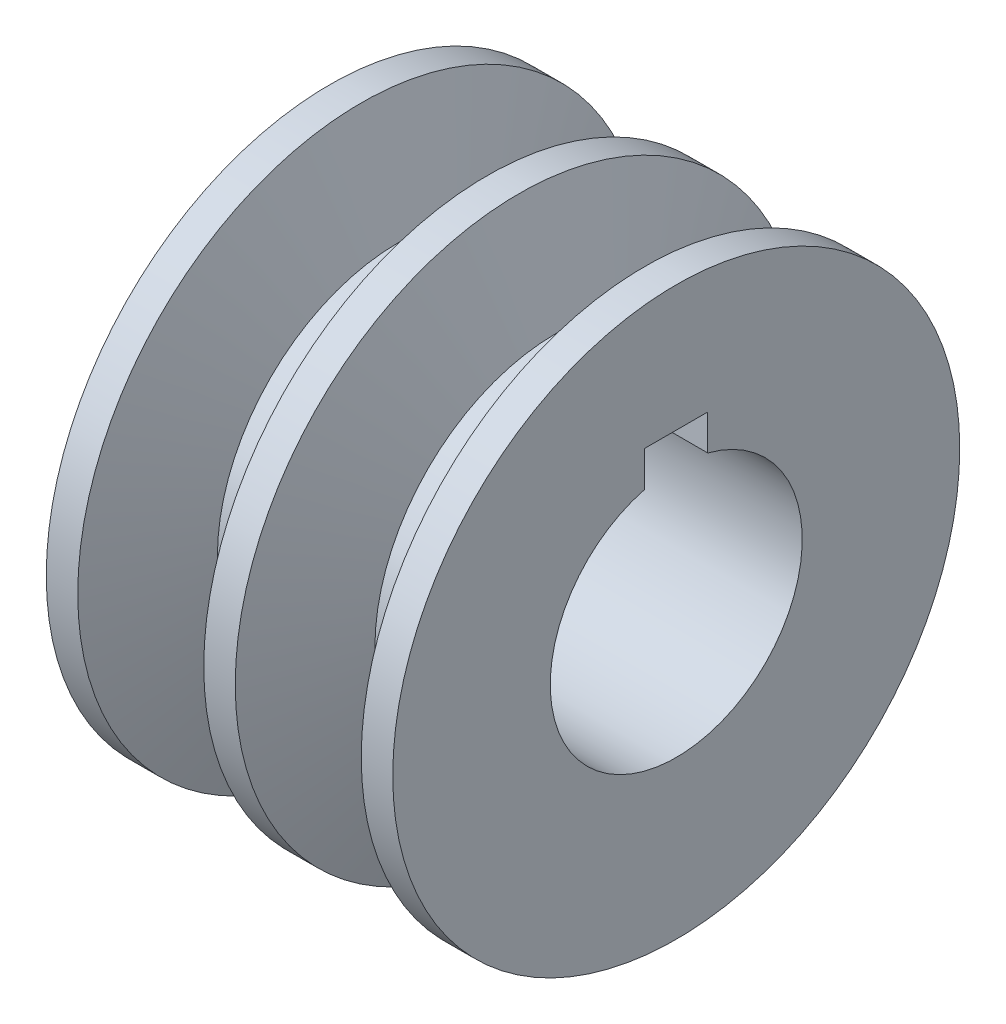
ISO-10303-21;
HEADER;
FILE_DESCRIPTION(('STEP AP214'),'2;1');
FILE_NAME('part.step','',(''),(''),'','','');
FILE_SCHEMA(('AUTOMOTIVE_DESIGN { 1 0 10303 214 1 1 1 1 }'));
ENDSEC;
DATA;
#1=APPLICATION_CONTEXT('core data for automotive mechanical design processes');
#2=APPLICATION_PROTOCOL_DEFINITION('international standard','automotive_design',2000,#1);
#3=PRODUCT_CONTEXT('',#1,'mechanical');
#4=PRODUCT('Part','Part','',(#3));
#5=PRODUCT_RELATED_PRODUCT_CATEGORY('part','',(#4));
#6=PRODUCT_DEFINITION_FORMATION('','',#4);
#7=PRODUCT_DEFINITION_CONTEXT('part definition',#1,'design');
#8=PRODUCT_DEFINITION('design','',#6,#7);
#9=PRODUCT_DEFINITION_SHAPE('','',#8);
#10=(LENGTH_UNIT() NAMED_UNIT(*) SI_UNIT(.MILLI.,.METRE.));
#11=(NAMED_UNIT(*) PLANE_ANGLE_UNIT() SI_UNIT($,.RADIAN.));
#12=(NAMED_UNIT(*) SI_UNIT($,.STERADIAN.) SOLID_ANGLE_UNIT());
#13=UNCERTAINTY_MEASURE_WITH_UNIT(LENGTH_MEASURE(1.E-05),#10,'distance_accuracy_value','');
#14=(GEOMETRIC_REPRESENTATION_CONTEXT(3) GLOBAL_UNCERTAINTY_ASSIGNED_CONTEXT((#13)) GLOBAL_UNIT_ASSIGNED_CONTEXT((#10,
#11,#12)) REPRESENTATION_CONTEXT('',''));
#15=CARTESIAN_POINT('',(0.,0.,0.));
#16=DIRECTION('',(0.,0.,1.));
#17=DIRECTION('',(1.,0.,0.));
#18=AXIS2_PLACEMENT_3D('',#15,#16,#17);
#19=CARTESIAN_POINT('',(38.1,0.,0.));
#20=DIRECTION('',(-1.,0.,0.));
#21=DIRECTION('',(0.,0.,1.));
#22=AXIS2_PLACEMENT_3D('',#19,#20,#21);
#23=CYLINDRICAL_SURFACE('',#22,28.575);
#24=CARTESIAN_POINT('',(3.17500000000003,0.,0.));
#25=DIRECTION('',(1.,0.,0.));
#26=DIRECTION('',(0.,0.,-1.));
#27=AXIS2_PLACEMENT_3D('',#24,#25,#26);
#28=CIRCLE('',#27,28.575);
#29=CARTESIAN_POINT('',(3.17500000000003,0.,28.575));
#30=VERTEX_POINT('',#29);
#31=EDGE_CURVE('E81',#30,#30,#28,.T.);
#32=CARTESIAN_POINT('',(0.,0.,0.));
#33=DIRECTION('',(1.,0.,0.));
#34=DIRECTION('',(0.,0.,-1.));
#35=AXIS2_PLACEMENT_3D('',#32,#33,#34);
#36=CIRCLE('',#35,28.575);
#37=CARTESIAN_POINT('',(0.,0.,28.575));
#38=VERTEX_POINT('',#37);
#39=EDGE_CURVE('E92',#38,#38,#36,.T.);
#40=CARTESIAN_POINT('',(3.17500000000003,0.,28.575));
#41=CARTESIAN_POINT('',(3.14192708333336,0.,28.575));
#42=CARTESIAN_POINT('',(3.10885416666669,0.,28.575));
#43=CARTESIAN_POINT('',(3.04270833333336,0.,28.575));
#44=CARTESIAN_POINT('',(3.00963541666669,0.,28.575));
#45=CARTESIAN_POINT('',(2.94348958333336,0.,28.575));
#46=CARTESIAN_POINT('',(2.91041666666669,0.,28.575));
#47=CARTESIAN_POINT('',(2.84427083333336,0.,28.575));
#48=CARTESIAN_POINT('',(2.81119791666669,0.,28.575));
#49=CARTESIAN_POINT('',(2.74505208333335,0.,28.575));
#50=CARTESIAN_POINT('',(2.71197916666669,0.,28.575));
#51=CARTESIAN_POINT('',(2.64583333333335,0.,28.575));
#52=CARTESIAN_POINT('',(2.61276041666669,0.,28.575));
#53=CARTESIAN_POINT('',(2.54661458333335,0.,28.575));
#54=CARTESIAN_POINT('',(2.51354166666669,0.,28.575));
#55=CARTESIAN_POINT('',(2.44739583333335,0.,28.575));
#56=CARTESIAN_POINT('',(2.41432291666668,0.,28.575));
#57=CARTESIAN_POINT('',(2.34817708333335,0.,28.575));
#58=CARTESIAN_POINT('',(2.31510416666668,0.,28.575));
#59=CARTESIAN_POINT('',(2.24895833333335,0.,28.575));
#60=CARTESIAN_POINT('',(2.21588541666669,0.,28.575));
#61=CARTESIAN_POINT('',(2.14973958333335,0.,28.575));
#62=CARTESIAN_POINT('',(2.11666666666668,0.,28.575));
#63=CARTESIAN_POINT('',(2.05052083333335,0.,28.575));
#64=CARTESIAN_POINT('',(2.01744791666668,0.,28.575));
#65=CARTESIAN_POINT('',(1.95130208333335,0.,28.575));
#66=CARTESIAN_POINT('',(1.91822916666668,0.,28.575));
#67=CARTESIAN_POINT('',(1.85208333333335,0.,28.575));
#68=CARTESIAN_POINT('',(1.81901041666668,0.,28.575));
#69=CARTESIAN_POINT('',(1.75286458333335,0.,28.575));
#70=CARTESIAN_POINT('',(1.71979166666668,0.,28.575));
#71=CARTESIAN_POINT('',(1.65364583333334,0.,28.575));
#72=CARTESIAN_POINT('',(1.62057291666668,0.,28.575));
#73=CARTESIAN_POINT('',(1.55442708333335,0.,28.575));
#74=CARTESIAN_POINT('',(1.52135416666668,0.,28.575));
#75=CARTESIAN_POINT('',(1.45520833333335,0.,28.575));
#76=CARTESIAN_POINT('',(1.42213541666668,0.,28.575));
#77=CARTESIAN_POINT('',(1.35598958333334,0.,28.575));
#78=CARTESIAN_POINT('',(1.32291666666668,0.,28.575));
#79=CARTESIAN_POINT('',(1.25677083333334,0.,28.575));
#80=CARTESIAN_POINT('',(1.22369791666668,0.,28.575));
#81=CARTESIAN_POINT('',(1.15755208333334,0.,28.575));
#82=CARTESIAN_POINT('',(1.12447916666668,0.,28.575));
#83=CARTESIAN_POINT('',(1.05833333333334,0.,28.575));
#84=CARTESIAN_POINT('',(1.02526041666667,0.,28.575));
#85=CARTESIAN_POINT('',(0.959114583333339,0.,28.575));
#86=CARTESIAN_POINT('',(0.926041666666673,0.,28.575));
#87=CARTESIAN_POINT('',(0.859895833333342,0.,28.575));
#88=CARTESIAN_POINT('',(0.826822916666676,0.,28.575));
#89=CARTESIAN_POINT('',(0.760677083333341,0.,28.575));
#90=CARTESIAN_POINT('',(0.727604166666673,0.,28.575));
#91=CARTESIAN_POINT('',(0.661458333333339,0.,28.575));
#92=CARTESIAN_POINT('',(0.628385416666673,0.,28.575));
#93=CARTESIAN_POINT('',(0.562239583333339,0.,28.575));
#94=CARTESIAN_POINT('',(0.529166666666671,0.,28.575));
#95=CARTESIAN_POINT('',(0.463020833333337,0.,28.575));
#96=CARTESIAN_POINT('',(0.429947916666671,0.,28.575));
#97=CARTESIAN_POINT('',(0.363802083333337,0.,28.575));
#98=CARTESIAN_POINT('',(0.330729166666668,0.,28.575));
#99=CARTESIAN_POINT('',(0.264583333333334,0.,28.575));
#100=CARTESIAN_POINT('',(0.231510416666668,0.,28.575));
#101=CARTESIAN_POINT('',(0.165364583333334,0.,28.575));
#102=CARTESIAN_POINT('',(0.132291666666666,0.,28.575));
#103=CARTESIAN_POINT('',(0.0661458333333318,0.,28.575));
#104=CARTESIAN_POINT('',(0.0330729166666659,0.,28.575));
#105=CARTESIAN_POINT('',(0.,0.,28.575));
#106=B_SPLINE_CURVE_WITH_KNOTS('',3,(#40,#41,#42,#43,#44,#45,#46,#47,#48,#49,#50,#51,#52,#53,
#54,#55,#56,#57,#58,#59,#60,#61,#62,#63,#64,#65,#66,#67,#68,#69,#70,#71,#72,#73,#74,#75,#76,#77,
#78,#79,#80,#81,#82,#83,#84,#85,#86,#87,#88,#89,#90,#91,#92,#93,#94,#95,#96,#97,#98,#99,#100,
#101,#102,#103,#104,#105),.UNSPECIFIED.,.F.,.F.,(4,2,2,2,2,2,2,2,2,2,2,2,2,2,2,2,2,2,2,2,2,2,2,
2,2,2,2,2,2,2,2,2,4),(0.,0.0992187499999977,0.198437500000002,0.29765625,0.396875000000005,
0.496093750000003,0.595312500000007,0.694531250000005,0.79375000000001,0.892968750000007,
0.992187500000005,1.09140625000001,1.19062500000001,1.28984375000001,1.38906250000001,
1.48828125000001,1.58750000000001,1.68671875000001,1.78593750000001,1.88515625000001,
1.98437500000002,2.08359375000002,2.18281250000002,2.28203125000002,2.38125000000002,
2.48046875000002,2.57968750000002,2.67890625000002,2.77812500000002,2.87734375000002,
2.97656250000002,3.07578125000003,3.17500000000003),.UNSPECIFIED.);
#107=EDGE_CURVE('BSEAM35',#30,#38,#106,.T.);
#108=ORIENTED_EDGE('',*,*,#31,.F.);
#109=ORIENTED_EDGE('',*,*,#39,.T.);
#110=ORIENTED_EDGE('',*,*,#107,.T.);
#111=ORIENTED_EDGE('',*,*,#107,.F.);
#112=EDGE_LOOP('',(#108,#110,#109,#111));
#113=FACE_BOUND('',#112,.T.);
#114=ADVANCED_FACE('F35',(#113),#23,.T.);
#115=CARTESIAN_POINT('',(38.1,0.,0.));
#116=DIRECTION('',(-1.,0.,0.));
#117=DIRECTION('',(0.,0.,1.));
#118=AXIS2_PLACEMENT_3D('',#115,#116,#117);
#119=CYLINDRICAL_SURFACE('',#118,12.7);
#120=CARTESIAN_POINT('',(34.925,0.,0.));
#121=DIRECTION('',(-1.,0.,0.));
#122=DIRECTION('',(0.,0.,1.));
#123=AXIS2_PLACEMENT_3D('',#120,#121,#122);
#124=CIRCLE('',#123,12.7);
#125=CARTESIAN_POINT('',(34.925,12.2967221242085,-3.175));
#126=VERTEX_POINT('',#125);
#127=CARTESIAN_POINT('',(34.925,12.2967221242085,3.175));
#128=VERTEX_POINT('',#127);
#129=EDGE_CURVE('E77',#126,#128,#124,.T.);
#130=ORIENTED_EDGE('',*,*,#129,.F.);
#131=DIRECTION('',(-1.,0.,0.));
#132=VECTOR('',#131,1.);
#133=CARTESIAN_POINT('',(38.1,12.2967221242085,-3.175));
#134=LINE('',#133,#132);
#135=CARTESIAN_POINT('',(0.,12.2967221242085,-3.175));
#136=VERTEX_POINT('',#135);
#137=EDGE_CURVE('E58',#126,#136,#134,.T.);
#138=ORIENTED_EDGE('',*,*,#137,.T.);
#139=CARTESIAN_POINT('',(0.,0.,0.));
#140=DIRECTION('',(1.,0.,0.));
#141=DIRECTION('',(0.,0.,-1.));
#142=AXIS2_PLACEMENT_3D('',#139,#140,#141);
#143=CIRCLE('',#142,12.7);
#144=CARTESIAN_POINT('',(0.,12.2967221242085,3.175));
#145=VERTEX_POINT('',#144);
#146=EDGE_CURVE('E84',#145,#136,#143,.T.);
#147=ORIENTED_EDGE('',*,*,#146,.F.);
#148=DIRECTION('',(-1.,0.,0.));
#149=VECTOR('',#148,1.);
#150=CARTESIAN_POINT('',(38.1,12.2967221242085,3.175));
#151=LINE('',#150,#149);
#152=EDGE_CURVE('E11',#128,#145,#151,.T.);
#153=ORIENTED_EDGE('',*,*,#152,.F.);
#154=EDGE_LOOP('',(#130,#138,#147,#153));
#155=FACE_BOUND('',#154,.T.);
#156=ADVANCED_FACE('F37',(#155),#119,.F.);
#157=CARTESIAN_POINT('',(38.1,0.,3.175));
#158=DIRECTION('',(0.,0.,1.));
#159=DIRECTION('',(1.,0.,0.));
#160=AXIS2_PLACEMENT_3D('',#157,#158,#159);
#161=PLANE('',#160);
#162=DIRECTION('',(-1.,0.,0.));
#163=VECTOR('',#162,1.);
#164=CARTESIAN_POINT('',(38.1,15.875,3.175));
#165=LINE('',#164,#163);
#166=CARTESIAN_POINT('',(34.925,15.875,3.175));
#167=VERTEX_POINT('',#166);
#168=CARTESIAN_POINT('',(0.,15.875,3.175));
#169=VERTEX_POINT('',#168);
#170=EDGE_CURVE('E43',#167,#169,#165,.T.);
#171=ORIENTED_EDGE('',*,*,#170,.F.);
#172=DIRECTION('',(0.,-1.,0.));
#173=VECTOR('',#172,1.);
#174=CARTESIAN_POINT('',(34.925,0.,3.175));
#175=LINE('',#174,#173);
#176=EDGE_CURVE('E85',#167,#128,#175,.T.);
#177=ORIENTED_EDGE('',*,*,#176,.T.);
#178=ORIENTED_EDGE('',*,*,#152,.T.);
#179=DIRECTION('',(0.,1.,0.));
#180=VECTOR('',#179,1.);
#181=CARTESIAN_POINT('',(0.,0.,3.175));
#182=LINE('',#181,#180);
#183=EDGE_CURVE('E107',#145,#169,#182,.T.);
#184=ORIENTED_EDGE('',*,*,#183,.T.);
#185=EDGE_LOOP('',(#171,#177,#178,#184));
#186=FACE_BOUND('',#185,.T.);
#187=ADVANCED_FACE('F108',(#186),#161,.F.);
#188=CARTESIAN_POINT('',(38.1,15.875,0.));
#189=DIRECTION('',(0.,1.,0.));
#190=DIRECTION('',(0.,0.,1.));
#191=AXIS2_PLACEMENT_3D('',#188,#189,#190);
#192=PLANE('',#191);
#193=DIRECTION('',(-1.,0.,0.));
#194=VECTOR('',#193,1.);
#195=CARTESIAN_POINT('',(38.1,15.875,-3.175));
#196=LINE('',#195,#194);
#197=CARTESIAN_POINT('',(34.925,15.875,-3.175));
#198=VERTEX_POINT('',#197);
#199=CARTESIAN_POINT('',(0.,15.875,-3.175));
#200=VERTEX_POINT('',#199);
#201=EDGE_CURVE('E91',#198,#200,#196,.T.);
#202=ORIENTED_EDGE('',*,*,#201,.F.);
#203=DIRECTION('',(0.,0.,1.));
#204=VECTOR('',#203,1.);
#205=CARTESIAN_POINT('',(34.925,15.875,0.));
#206=LINE('',#205,#204);
#207=EDGE_CURVE('E50',#198,#167,#206,.T.);
#208=ORIENTED_EDGE('',*,*,#207,.T.);
#209=ORIENTED_EDGE('',*,*,#170,.T.);
#210=DIRECTION('',(0.,0.,-1.));
#211=VECTOR('',#210,1.);
#212=CARTESIAN_POINT('',(0.,15.875,0.));
#213=LINE('',#212,#211);
#214=EDGE_CURVE('E104',#169,#200,#213,.T.);
#215=ORIENTED_EDGE('',*,*,#214,.T.);
#216=EDGE_LOOP('',(#202,#208,#209,#215));
#217=FACE_BOUND('',#216,.T.);
#218=ADVANCED_FACE('F102',(#217),#192,.F.);
#219=CARTESIAN_POINT('',(38.1,0.,-3.175));
#220=DIRECTION('',(0.,0.,1.));
#221=DIRECTION('',(1.,0.,0.));
#222=AXIS2_PLACEMENT_3D('',#219,#220,#221);
#223=PLANE('',#222);
#224=DIRECTION('',(0.,-1.,0.));
#225=VECTOR('',#224,1.);
#226=CARTESIAN_POINT('',(34.925,0.,-3.175));
#227=LINE('',#226,#225);
#228=EDGE_CURVE('E74',#198,#126,#227,.T.);
#229=ORIENTED_EDGE('',*,*,#228,.F.);
#230=ORIENTED_EDGE('',*,*,#201,.T.);
#231=DIRECTION('',(0.,1.,0.));
#232=VECTOR('',#231,1.);
#233=CARTESIAN_POINT('',(0.,0.,-3.175));
#234=LINE('',#233,#232);
#235=EDGE_CURVE('E90',#136,#200,#234,.T.);
#236=ORIENTED_EDGE('',*,*,#235,.F.);
#237=ORIENTED_EDGE('',*,*,#137,.F.);
#238=EDGE_LOOP('',(#229,#230,#236,#237));
#239=FACE_BOUND('',#238,.T.);
#240=ADVANCED_FACE('F88',(#239),#223,.T.);
#241=CARTESIAN_POINT('',(0.,0.,0.));
#242=DIRECTION('',(1.,0.,0.));
#243=DIRECTION('',(0.,0.,-1.));
#244=AXIS2_PLACEMENT_3D('',#241,#242,#243);
#245=PLANE('',#244);
#246=ORIENTED_EDGE('',*,*,#146,.T.);
#247=ORIENTED_EDGE('',*,*,#235,.T.);
#248=ORIENTED_EDGE('',*,*,#214,.F.);
#249=ORIENTED_EDGE('',*,*,#183,.F.);
#250=EDGE_LOOP('',(#246,#247,#248,#249));
#251=FACE_BOUND('',#250,.T.);
#252=ORIENTED_EDGE('',*,*,#39,.F.);
#253=EDGE_LOOP('',(#252));
#254=FACE_BOUND('',#253,.T.);
#255=ADVANCED_FACE('F111',(#251,#254),#245,.F.);
#256=CARTESIAN_POINT('',(34.925,28.575,0.));
#257=DIRECTION('',(-1.,0.,0.));
#258=DIRECTION('',(0.,0.,1.));
#259=AXIS2_PLACEMENT_3D('',#256,#257,#258);
#260=PLANE('',#259);
#261=ORIENTED_EDGE('',*,*,#129,.T.);
#262=ORIENTED_EDGE('',*,*,#176,.F.);
#263=ORIENTED_EDGE('',*,*,#207,.F.);
#264=ORIENTED_EDGE('',*,*,#228,.T.);
#265=EDGE_LOOP('',(#261,#262,#263,#264));
#266=FACE_BOUND('',#265,.T.);
#267=CARTESIAN_POINT('',(34.925,0.,0.));
#268=DIRECTION('',(1.,0.,0.));
#269=DIRECTION('',(0.,0.,-1.));
#270=AXIS2_PLACEMENT_3D('',#267,#268,#269);
#271=CIRCLE('',#270,28.575);
#272=CARTESIAN_POINT('',(34.925,0.,28.575));
#273=VERTEX_POINT('',#272);
#274=EDGE_CURVE('E141',#273,#273,#271,.T.);
#275=ORIENTED_EDGE('',*,*,#274,.T.);
#276=EDGE_LOOP('',(#275));
#277=FACE_BOUND('',#276,.T.);
#278=ADVANCED_FACE('F75',(#266,#277),#260,.F.);
#279=CARTESIAN_POINT('',(3.17500000000003,0.,0.));
#280=DIRECTION('',(-1.,0.,0.));
#281=DIRECTION('',(0.,0.,1.));
#282=AXIS2_PLACEMENT_3D('',#279,#280,#281);
#283=CONICAL_SURFACE('',#282,28.575,1.22173047639603);
#284=CARTESIAN_POINT('',(6.93071785483437,0.,0.));
#285=DIRECTION('',(1.,0.,0.));
#286=DIRECTION('',(0.,0.,-1.));
#287=AXIS2_PLACEMENT_3D('',#284,#285,#286);
#288=CIRCLE('',#287,18.25625);
#289=CARTESIAN_POINT('',(6.93071785483437,0.,-18.25625));
#290=VERTEX_POINT('',#289);
#291=EDGE_CURVE('E120',#290,#290,#288,.T.);
#292=ORIENTED_EDGE('',*,*,#291,.F.);
#293=EDGE_LOOP('',(#292));
#294=FACE_BOUND('',#293,.T.);
#295=ORIENTED_EDGE('',*,*,#31,.T.);
#296=EDGE_LOOP('',(#295));
#297=FACE_BOUND('',#296,.T.);
#298=ADVANCED_FACE('F183',(#294,#297),#283,.T.);
#299=CARTESIAN_POINT('',(-1.26294314309024,0.,0.));
#300=DIRECTION('',(1.,0.,0.));
#301=DIRECTION('',(0.,0.,-1.));
#302=AXIS2_PLACEMENT_3D('',#299,#300,#301);
#303=CYLINDRICAL_SURFACE('',#302,18.25625);
#304=CARTESIAN_POINT('',(12.1192821451657,0.,0.));
#305=DIRECTION('',(1.,0.,0.));
#306=DIRECTION('',(0.,0.,-1.));
#307=AXIS2_PLACEMENT_3D('',#304,#305,#306);
#308=CIRCLE('',#307,18.25625);
#309=CARTESIAN_POINT('',(12.1192821451657,0.,-18.25625));
#310=VERTEX_POINT('',#309);
#311=EDGE_CURVE('E123',#310,#310,#308,.T.);
#312=ORIENTED_EDGE('',*,*,#311,.F.);
#313=EDGE_LOOP('',(#312));
#314=FACE_BOUND('',#313,.T.);
#315=ORIENTED_EDGE('',*,*,#291,.T.);
#316=EDGE_LOOP('',(#315));
#317=FACE_BOUND('',#316,.T.);
#318=ADVANCED_FACE('F159',(#314,#317),#303,.T.);
#319=CARTESIAN_POINT('',(12.1192821451657,0.,0.));
#320=DIRECTION('',(1.,0.,0.));
#321=DIRECTION('',(0.,0.,-1.));
#322=AXIS2_PLACEMENT_3D('',#319,#320,#321);
#323=CONICAL_SURFACE('',#322,18.25625,1.22173047639603);
#324=CARTESIAN_POINT('',(15.875,0.,0.));
#325=DIRECTION('',(1.,0.,0.));
#326=DIRECTION('',(0.,0.,-1.));
#327=AXIS2_PLACEMENT_3D('',#324,#325,#326);
#328=CIRCLE('',#327,28.575);
#329=CARTESIAN_POINT('',(15.875,0.,28.575));
#330=VERTEX_POINT('',#329);
#331=EDGE_CURVE('E126',#330,#330,#328,.T.);
#332=ORIENTED_EDGE('',*,*,#331,.F.);
#333=EDGE_LOOP('',(#332));
#334=FACE_BOUND('',#333,.T.);
#335=ORIENTED_EDGE('',*,*,#311,.T.);
#336=EDGE_LOOP('',(#335));
#337=FACE_BOUND('',#336,.T.);
#338=ADVANCED_FACE('F148',(#334,#337),#323,.T.);
#339=CARTESIAN_POINT('',(31.75,0.,0.));
#340=DIRECTION('',(1.,0.,0.));
#341=DIRECTION('',(0.,0.,-1.));
#342=AXIS2_PLACEMENT_3D('',#339,#340,#341);
#343=CIRCLE('',#342,28.575);
#344=CARTESIAN_POINT('',(31.75,0.,28.575));
#345=VERTEX_POINT('',#344);
#346=EDGE_CURVE('E138',#345,#345,#343,.T.);
#347=CARTESIAN_POINT('',(31.75,0.,28.575));
#348=CARTESIAN_POINT('',(31.7830729166667,0.,28.575));
#349=CARTESIAN_POINT('',(31.8161458333334,0.,28.575));
#350=CARTESIAN_POINT('',(31.8822916666667,0.,28.575));
#351=CARTESIAN_POINT('',(31.9153645833334,0.,28.575));
#352=CARTESIAN_POINT('',(31.9815104166667,0.,28.575));
#353=CARTESIAN_POINT('',(32.0145833333334,0.,28.575));
#354=CARTESIAN_POINT('',(32.0807291666667,0.,28.575));
#355=CARTESIAN_POINT('',(32.1138020833334,0.,28.575));
#356=CARTESIAN_POINT('',(32.1799479166667,0.,28.575));
#357=CARTESIAN_POINT('',(32.2130208333334,0.,28.575));
#358=CARTESIAN_POINT('',(32.2791666666667,0.,28.575));
#359=CARTESIAN_POINT('',(32.3122395833334,0.,28.575));
#360=CARTESIAN_POINT('',(32.3783854166667,0.,28.575));
#361=CARTESIAN_POINT('',(32.4114583333334,0.,28.575));
#362=CARTESIAN_POINT('',(32.4776041666667,0.,28.575));
#363=CARTESIAN_POINT('',(32.5106770833334,0.,28.575));
#364=CARTESIAN_POINT('',(32.5768229166667,0.,28.575));
#365=CARTESIAN_POINT('',(32.6098958333334,0.,28.575));
#366=CARTESIAN_POINT('',(32.6760416666667,0.,28.575));
#367=CARTESIAN_POINT('',(32.7091145833334,0.,28.575));
#368=CARTESIAN_POINT('',(32.7752604166667,0.,28.575));
#369=CARTESIAN_POINT('',(32.8083333333334,0.,28.575));
#370=CARTESIAN_POINT('',(32.8744791666667,0.,28.575));
#371=CARTESIAN_POINT('',(32.9075520833334,0.,28.575));
#372=CARTESIAN_POINT('',(32.9736979166667,0.,28.575));
#373=CARTESIAN_POINT('',(33.0067708333333,0.,28.575));
#374=CARTESIAN_POINT('',(33.0729166666667,0.,28.575));
#375=CARTESIAN_POINT('',(33.1059895833334,0.,28.575));
#376=CARTESIAN_POINT('',(33.1721354166667,0.,28.575));
#377=CARTESIAN_POINT('',(33.2052083333334,0.,28.575));
#378=CARTESIAN_POINT('',(33.2713541666667,0.,28.575));
#379=CARTESIAN_POINT('',(33.3044270833334,0.,28.575));
#380=CARTESIAN_POINT('',(33.3705729166667,0.,28.575));
#381=CARTESIAN_POINT('',(33.4036458333334,0.,28.575));
#382=CARTESIAN_POINT('',(33.4697916666667,0.,28.575));
#383=CARTESIAN_POINT('',(33.5028645833334,0.,28.575));
#384=CARTESIAN_POINT('',(33.5690104166667,0.,28.575));
#385=CARTESIAN_POINT('',(33.6020833333334,0.,28.575));
#386=CARTESIAN_POINT('',(33.6682291666667,0.,28.575));
#387=CARTESIAN_POINT('',(33.7013020833334,0.,28.575));
#388=CARTESIAN_POINT('',(33.7674479166667,0.,28.575));
#389=CARTESIAN_POINT('',(33.8005208333334,0.,28.575));
#390=CARTESIAN_POINT('',(33.8666666666667,0.,28.575));
#391=CARTESIAN_POINT('',(33.8997395833333,0.,28.575));
#392=CARTESIAN_POINT('',(33.9658854166667,0.,28.575));
#393=CARTESIAN_POINT('',(33.9989583333334,0.,28.575));
#394=CARTESIAN_POINT('',(34.0651041666667,0.,28.575));
#395=CARTESIAN_POINT('',(34.0981770833334,0.,28.575));
#396=CARTESIAN_POINT('',(34.1643229166667,0.,28.575));
#397=CARTESIAN_POINT('',(34.1973958333334,0.,28.575));
#398=CARTESIAN_POINT('',(34.2635416666667,0.,28.575));
#399=CARTESIAN_POINT('',(34.2966145833334,0.,28.575));
#400=CARTESIAN_POINT('',(34.3627604166667,0.,28.575));
#401=CARTESIAN_POINT('',(34.3958333333334,0.,28.575));
#402=CARTESIAN_POINT('',(34.4619791666667,0.,28.575));
#403=CARTESIAN_POINT('',(34.4950520833334,0.,28.575));
#404=CARTESIAN_POINT('',(34.5611979166667,0.,28.575));
#405=CARTESIAN_POINT('',(34.5942708333334,0.,28.575));
#406=CARTESIAN_POINT('',(34.6604166666667,0.,28.575));
#407=CARTESIAN_POINT('',(34.6934895833334,0.,28.575));
#408=CARTESIAN_POINT('',(34.7596354166667,0.,28.575));
#409=CARTESIAN_POINT('',(34.7927083333334,0.,28.575));
#410=CARTESIAN_POINT('',(34.8588541666667,0.,28.575));
#411=CARTESIAN_POINT('',(34.8919270833333,0.,28.575));
#412=CARTESIAN_POINT('',(34.925,0.,28.575));
#413=B_SPLINE_CURVE_WITH_KNOTS('',3,(#347,#348,#349,#350,#351,#352,#353,#354,#355,#356,#357,
#358,#359,#360,#361,#362,#363,#364,#365,#366,#367,#368,#369,#370,#371,#372,#373,#374,#375,#376,
#377,#378,#379,#380,#381,#382,#383,#384,#385,#386,#387,#388,#389,#390,#391,#392,#393,#394,#395,
#396,#397,#398,#399,#400,#401,#402,#403,#404,#405,#406,#407,#408,#409,#410,#411,#412),
.UNSPECIFIED.,.F.,.F.,(4,2,2,2,2,2,2,2,2,2,2,2,2,2,2,2,2,2,2,2,2,2,2,2,2,2,2,2,2,2,2,2,4),(0.,
0.0992187500000047,0.198437500000002,0.29765625,0.396875000000005,0.496093750000003,0.5953125,
0.694531250000005,0.793750000000003,0.892968750000001,0.992187499999998,1.09140625,1.190625,
1.28984375,1.3890625,1.48828125,1.5875,1.68671875,1.7859375,1.88515625,1.984375,2.08359375,
2.1828125,2.28203125,2.38125,2.48046875,2.5796875,2.67890625,2.778125,2.87734375,2.9765625,
3.07578125,3.175),.UNSPECIFIED.);
#414=EDGE_CURVE('BSEAM145',#345,#273,#413,.T.);
#415=ORIENTED_EDGE('',*,*,#346,.T.);
#416=ORIENTED_EDGE('',*,*,#274,.F.);
#417=ORIENTED_EDGE('',*,*,#414,.T.);
#418=ORIENTED_EDGE('',*,*,#414,.F.);
#419=EDGE_LOOP('',(#415,#417,#416,#418));
#420=FACE_BOUND('',#419,.T.);
#421=ADVANCED_FACE('F145',(#420),#23,.T.);
#422=CARTESIAN_POINT('',(19.05,0.,0.));
#423=DIRECTION('',(-1.,0.,0.));
#424=DIRECTION('',(0.,0.,1.));
#425=AXIS2_PLACEMENT_3D('',#422,#423,#424);
#426=CONICAL_SURFACE('',#425,28.575,1.22173047639603);
#427=CARTESIAN_POINT('',(22.8057178548344,0.,0.));
#428=DIRECTION('',(1.,0.,0.));
#429=DIRECTION('',(0.,0.,-1.));
#430=AXIS2_PLACEMENT_3D('',#427,#428,#429);
#431=CIRCLE('',#430,18.25625);
#432=CARTESIAN_POINT('',(22.8057178548344,0.,-18.25625));
#433=VERTEX_POINT('',#432);
#434=EDGE_CURVE('E132',#433,#433,#431,.T.);
#435=ORIENTED_EDGE('',*,*,#434,.F.);
#436=EDGE_LOOP('',(#435));
#437=FACE_BOUND('',#436,.T.);
#438=CARTESIAN_POINT('',(19.05,0.,0.));
#439=DIRECTION('',(1.,0.,0.));
#440=DIRECTION('',(0.,0.,-1.));
#441=AXIS2_PLACEMENT_3D('',#438,#439,#440);
#442=CIRCLE('',#441,28.575);
#443=CARTESIAN_POINT('',(19.05,0.,28.575));
#444=VERTEX_POINT('',#443);
#445=EDGE_CURVE('E129',#444,#444,#442,.T.);
#446=ORIENTED_EDGE('',*,*,#445,.T.);
#447=EDGE_LOOP('',(#446));
#448=FACE_BOUND('',#447,.T.);
#449=ADVANCED_FACE('F147',(#437,#448),#426,.T.);
#450=CARTESIAN_POINT('',(-1.26294314309024,0.,0.));
#451=DIRECTION('',(1.,0.,0.));
#452=DIRECTION('',(0.,0.,-1.));
#453=AXIS2_PLACEMENT_3D('',#450,#451,#452);
#454=CYLINDRICAL_SURFACE('',#453,18.25625);
#455=CARTESIAN_POINT('',(27.9942821451657,0.,0.));
#456=DIRECTION('',(1.,0.,0.));
#457=DIRECTION('',(0.,0.,-1.));
#458=AXIS2_PLACEMENT_3D('',#455,#456,#457);
#459=CIRCLE('',#458,18.25625);
#460=CARTESIAN_POINT('',(27.9942821451657,0.,-18.25625));
#461=VERTEX_POINT('',#460);
#462=EDGE_CURVE('E135',#461,#461,#459,.T.);
#463=ORIENTED_EDGE('',*,*,#462,.F.);
#464=EDGE_LOOP('',(#463));
#465=FACE_BOUND('',#464,.T.);
#466=ORIENTED_EDGE('',*,*,#434,.T.);
#467=EDGE_LOOP('',(#466));
#468=FACE_BOUND('',#467,.T.);
#469=ADVANCED_FACE('F156',(#465,#468),#454,.T.);
#470=CARTESIAN_POINT('',(27.9942821451657,0.,0.));
#471=DIRECTION('',(1.,0.,0.));
#472=DIRECTION('',(0.,0.,-1.));
#473=AXIS2_PLACEMENT_3D('',#470,#471,#472);
#474=CONICAL_SURFACE('',#473,18.25625,1.22173047639603);
#475=ORIENTED_EDGE('',*,*,#346,.F.);
#476=EDGE_LOOP('',(#475));
#477=FACE_BOUND('',#476,.T.);
#478=ORIENTED_EDGE('',*,*,#462,.T.);
#479=EDGE_LOOP('',(#478));
#480=FACE_BOUND('',#479,.T.);
#481=ADVANCED_FACE('F167',(#477,#480),#474,.T.);
#482=CARTESIAN_POINT('',(15.875,0.,28.575));
#483=CARTESIAN_POINT('',(15.9080729166667,0.,28.575));
#484=CARTESIAN_POINT('',(15.9411458333334,0.,28.575));
#485=CARTESIAN_POINT('',(16.0072916666667,0.,28.575));
#486=CARTESIAN_POINT('',(16.0403645833334,0.,28.575));
#487=CARTESIAN_POINT('',(16.1065104166667,0.,28.575));
#488=CARTESIAN_POINT('',(16.1395833333334,0.,28.575));
#489=CARTESIAN_POINT('',(16.2057291666667,0.,28.575));
#490=CARTESIAN_POINT('',(16.2388020833334,0.,28.575));
#491=CARTESIAN_POINT('',(16.3049479166667,0.,28.575));
#492=CARTESIAN_POINT('',(16.3380208333334,0.,28.575));
#493=CARTESIAN_POINT('',(16.4041666666667,0.,28.575));
#494=CARTESIAN_POINT('',(16.4372395833334,0.,28.575));
#495=CARTESIAN_POINT('',(16.5033854166667,0.,28.575));
#496=CARTESIAN_POINT('',(16.5364583333334,0.,28.575));
#497=CARTESIAN_POINT('',(16.6026041666667,0.,28.575));
#498=CARTESIAN_POINT('',(16.6356770833334,0.,28.575));
#499=CARTESIAN_POINT('',(16.7018229166667,0.,28.575));
#500=CARTESIAN_POINT('',(16.7348958333334,0.,28.575));
#501=CARTESIAN_POINT('',(16.8010416666667,0.,28.575));
#502=CARTESIAN_POINT('',(16.8341145833334,0.,28.575));
#503=CARTESIAN_POINT('',(16.9002604166667,0.,28.575));
#504=CARTESIAN_POINT('',(16.9333333333334,0.,28.575));
#505=CARTESIAN_POINT('',(16.9994791666667,0.,28.575));
#506=CARTESIAN_POINT('',(17.0325520833334,0.,28.575));
#507=CARTESIAN_POINT('',(17.0986979166667,0.,28.575));
#508=CARTESIAN_POINT('',(17.1317708333334,0.,28.575));
#509=CARTESIAN_POINT('',(17.1979166666667,0.,28.575));
#510=CARTESIAN_POINT('',(17.2309895833334,0.,28.575));
#511=CARTESIAN_POINT('',(17.2971354166667,0.,28.575));
#512=CARTESIAN_POINT('',(17.3302083333334,0.,28.575));
#513=CARTESIAN_POINT('',(17.3963541666667,0.,28.575));
#514=CARTESIAN_POINT('',(17.4294270833334,0.,28.575));
#515=CARTESIAN_POINT('',(17.4955729166667,0.,28.575));
#516=CARTESIAN_POINT('',(17.5286458333334,0.,28.575));
#517=CARTESIAN_POINT('',(17.5947916666667,0.,28.575));
#518=CARTESIAN_POINT('',(17.6278645833334,0.,28.575));
#519=CARTESIAN_POINT('',(17.6940104166667,0.,28.575));
#520=CARTESIAN_POINT('',(17.7270833333334,0.,28.575));
#521=CARTESIAN_POINT('',(17.7932291666667,0.,28.575));
#522=CARTESIAN_POINT('',(17.8263020833334,0.,28.575));
#523=CARTESIAN_POINT('',(17.8924479166667,0.,28.575));
#524=CARTESIAN_POINT('',(17.9255208333334,0.,28.575));
#525=CARTESIAN_POINT('',(17.9916666666667,0.,28.575));
#526=CARTESIAN_POINT('',(18.0247395833334,0.,28.575));
#527=CARTESIAN_POINT('',(18.0908854166667,0.,28.575));
#528=CARTESIAN_POINT('',(18.1239583333334,0.,28.575));
#529=CARTESIAN_POINT('',(18.1901041666667,0.,28.575));
#530=CARTESIAN_POINT('',(18.2231770833334,0.,28.575));
#531=CARTESIAN_POINT('',(18.2893229166667,0.,28.575));
#532=CARTESIAN_POINT('',(18.3223958333334,0.,28.575));
#533=CARTESIAN_POINT('',(18.3885416666667,0.,28.575));
#534=CARTESIAN_POINT('',(18.4216145833334,0.,28.575));
#535=CARTESIAN_POINT('',(18.4877604166667,0.,28.575));
#536=CARTESIAN_POINT('',(18.5208333333334,0.,28.575));
#537=CARTESIAN_POINT('',(18.5869791666667,0.,28.575));
#538=CARTESIAN_POINT('',(18.6200520833334,0.,28.575));
#539=CARTESIAN_POINT('',(18.6861979166667,0.,28.575));
#540=CARTESIAN_POINT('',(18.7192708333334,0.,28.575));
#541=CARTESIAN_POINT('',(18.7854166666667,0.,28.575));
#542=CARTESIAN_POINT('',(18.8184895833334,0.,28.575));
#543=CARTESIAN_POINT('',(18.8846354166667,0.,28.575));
#544=CARTESIAN_POINT('',(18.9177083333334,0.,28.575));
#545=CARTESIAN_POINT('',(18.9838541666667,0.,28.575));
#546=CARTESIAN_POINT('',(19.0169270833334,0.,28.575));
#547=CARTESIAN_POINT('',(19.05,0.,28.575));
#548=B_SPLINE_CURVE_WITH_KNOTS('',3,(#482,#483,#484,#485,#486,#487,#488,#489,#490,#491,#492,
#493,#494,#495,#496,#497,#498,#499,#500,#501,#502,#503,#504,#505,#506,#507,#508,#509,#510,#511,
#512,#513,#514,#515,#516,#517,#518,#519,#520,#521,#522,#523,#524,#525,#526,#527,#528,#529,#530,
#531,#532,#533,#534,#535,#536,#537,#538,#539,#540,#541,#542,#543,#544,#545,#546,#547),
.UNSPECIFIED.,.F.,.F.,(4,2,2,2,2,2,2,2,2,2,2,2,2,2,2,2,2,2,2,2,2,2,2,2,2,2,2,2,2,2,2,2,4),(0.,
0.0992187500000012,0.198437499999999,0.29765625,0.396875000000001,0.496093749999999,0.5953125,
0.694531250000002,0.793750000000003,0.892968750000001,0.992187500000002,1.09140625,1.190625,
1.28984375,1.3890625,1.48828125,1.5875,1.68671875,1.7859375,1.88515625,1.984375,2.08359375,
2.1828125,2.28203125,2.38125,2.48046875,2.5796875,2.67890625,2.778125,2.87734375,
2.97656250000001,3.07578125,3.175),.UNSPECIFIED.);
#549=EDGE_CURVE('BSEAM151',#330,#444,#548,.T.);
#550=ORIENTED_EDGE('',*,*,#331,.T.);
#551=ORIENTED_EDGE('',*,*,#445,.F.);
#552=ORIENTED_EDGE('',*,*,#549,.T.);
#553=ORIENTED_EDGE('',*,*,#549,.F.);
#554=EDGE_LOOP('',(#550,#552,#551,#553));
#555=FACE_BOUND('',#554,.T.);
#556=ADVANCED_FACE('F151',(#555),#23,.T.);
#557=CLOSED_SHELL('',(#114,#156,#187,#218,#240,#255,#278,#298,#318,#338,#421,#449,#469,#481,#556));
#558=MANIFOLD_SOLID_BREP('B2',#557);
#559=ADVANCED_BREP_SHAPE_REPRESENTATION('',(#18,#558),#14);
#560=SHAPE_DEFINITION_REPRESENTATION(#9,#559);
ENDSEC;
END-ISO-10303-21;
